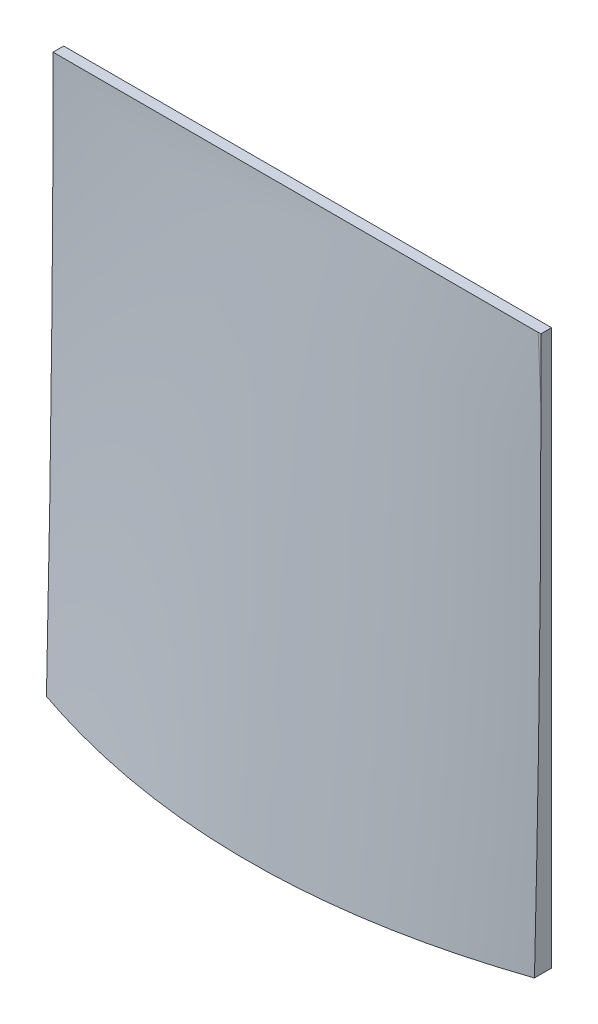
ISO-10303-21;
HEADER;
FILE_DESCRIPTION(('STEP AP214'),'2;1');
FILE_NAME('part.step','',(''),(''),'','','');
FILE_SCHEMA(('AUTOMOTIVE_DESIGN { 1 0 10303 214 1 1 1 1 }'));
ENDSEC;
DATA;
#1=APPLICATION_CONTEXT('core data for automotive mechanical design processes');
#2=APPLICATION_PROTOCOL_DEFINITION('international standard','automotive_design',2000,#1);
#3=PRODUCT_CONTEXT('',#1,'mechanical');
#4=PRODUCT('Part','Part','',(#3));
#5=PRODUCT_RELATED_PRODUCT_CATEGORY('part','',(#4));
#6=PRODUCT_DEFINITION_FORMATION('','',#4);
#7=PRODUCT_DEFINITION_CONTEXT('part definition',#1,'design');
#8=PRODUCT_DEFINITION('design','',#6,#7);
#9=PRODUCT_DEFINITION_SHAPE('','',#8);
#10=(LENGTH_UNIT() NAMED_UNIT(*) SI_UNIT(.MILLI.,.METRE.));
#11=(NAMED_UNIT(*) PLANE_ANGLE_UNIT() SI_UNIT($,.RADIAN.));
#12=(NAMED_UNIT(*) SI_UNIT($,.STERADIAN.) SOLID_ANGLE_UNIT());
#13=UNCERTAINTY_MEASURE_WITH_UNIT(LENGTH_MEASURE(1.E-05),#10,'distance_accuracy_value','');
#14=(GEOMETRIC_REPRESENTATION_CONTEXT(3) GLOBAL_UNCERTAINTY_ASSIGNED_CONTEXT((#13)) GLOBAL_UNIT_ASSIGNED_CONTEXT((#10,
#11,#12)) REPRESENTATION_CONTEXT('',''));
#15=CARTESIAN_POINT('',(0.,0.,0.));
#16=DIRECTION('',(0.,0.,1.));
#17=DIRECTION('',(1.,0.,0.));
#18=AXIS2_PLACEMENT_3D('',#15,#16,#17);
#19=CARTESIAN_POINT('',(-76.6790209222902,0.182393041457334,23.759244427129));
#20=DIRECTION('',(0.,1.,0.));
#21=DIRECTION('',(0.,0.,1.));
#22=AXIS2_PLACEMENT_3D('',#19,#20,#21);
#23=PLANE('',#22);
#24=DIRECTION('',(1.,0.,0.));
#25=VECTOR('',#24,1.);
#26=CARTESIAN_POINT('',(-76.6790209222902,0.182393041457334,45.2732626857592));
#27=LINE('',#26,#25);
#28=CARTESIAN_POINT('',(-72.7718331954869,0.182393041457337,45.2732626857592));
#29=VERTEX_POINT('',#28);
#30=CARTESIAN_POINT('',(11.2281668045131,0.182393041457337,45.2732626857592));
#31=VERTEX_POINT('',#30);
#32=EDGE_CURVE('E275',#29,#31,#27,.T.);
#33=ORIENTED_EDGE('',*,*,#32,.F.);
#34=DIRECTION('',(0.,0.,-1.));
#35=VECTOR('',#34,1.);
#36=CARTESIAN_POINT('',(-72.7718331954869,0.182393041457334,23.759244427129));
#37=LINE('',#36,#35);
#38=CARTESIAN_POINT('',(-72.7718331954869,0.182393041457334,47.1068527896374));
#39=VERTEX_POINT('',#38);
#40=EDGE_CURVE('E410',#39,#29,#37,.T.);
#41=ORIENTED_EDGE('',*,*,#40,.F.);
#42=DIRECTION('',(-0.999999985976568,0.,-0.00016747198213223));
#43=VECTOR('',#42,1.);
#44=CARTESIAN_POINT('',(-13.2520324405441,0.182393041457334,47.1168206887858));
#45=LINE('',#44,#43);
#46=CARTESIAN_POINT('',(-13.252032528791,0.182393041457334,47.1171866181923));
#47=VERTEX_POINT('',#46);
#48=EDGE_CURVE('E402',#47,#39,#45,.T.);
#49=ORIENTED_EDGE('',*,*,#48,.F.);
#50=DIRECTION('',(-0.999999910863304,0.,-0.000422224329477457));
#51=VECTOR('',#50,1.);
#52=CARTESIAN_POINT('',(10.7711074982682,0.182393041457334,47.1269638438425));
#53=LINE('',#52,#51);
#54=CARTESIAN_POINT('',(10.7711074982682,0.182393041457334,47.1269638438425));
#55=VERTEX_POINT('',#54);
#56=EDGE_CURVE('E405',#55,#47,#53,.T.);
#57=ORIENTED_EDGE('',*,*,#56,.F.);
#58=CARTESIAN_POINT('',(16.8505701588361,0.182393041457334,41.219962713963));
#59=CARTESIAN_POINT('',(16.8505653065241,0.182393041457334,41.6161075892301));
#60=CARTESIAN_POINT('',(16.8109421728378,0.182393041457334,42.0055313352953));
#61=CARTESIAN_POINT('',(16.6937660953731,0.182393041457334,42.5798712933694));
#62=CARTESIAN_POINT('',(16.6450152847532,0.182393041457334,42.7696737056762));
#63=CARTESIAN_POINT('',(16.527577589674,0.182393041457334,43.1458964318391));
#64=CARTESIAN_POINT('',(16.4587360491249,0.182393041457334,43.332289012593));
#65=CARTESIAN_POINT('',(16.2269249631052,0.182393041457334,43.8735989554252));
#66=CARTESIAN_POINT('',(16.0376753154703,0.182393041457334,44.2152440164193));
#67=CARTESIAN_POINT('',(15.7021983661332,0.182393041457334,44.6991245925857));
#68=CARTESIAN_POINT('',(15.5809595518373,0.182393041457334,44.8564583319023));
#69=CARTESIAN_POINT('',(15.3249039031078,0.182393041457334,45.1561566231294));
#70=CARTESIAN_POINT('',(15.1902206967655,0.182393041457334,45.2985817503454));
#71=CARTESIAN_POINT('',(14.766849183668,0.182393041457334,45.7043037339263));
#72=CARTESIAN_POINT('',(14.4590154618272,0.182393041457334,45.9462440529349));
#73=CARTESIAN_POINT('',(13.7911949373199,0.182393041457334,46.3719484010205));
#74=CARTESIAN_POINT('',(13.4417681116564,0.182393041457334,46.5489713969958));
#75=CARTESIAN_POINT('',(12.7142905543304,0.182393041457334,46.8352684760273));
#76=CARTESIAN_POINT('',(12.3326337261691,0.182393041457334,46.9450813361561));
#77=CARTESIAN_POINT('',(11.5584589805988,0.182393041457334,47.0906357276693));
#78=CARTESIAN_POINT('',(11.1669800896846,0.182393041457334,47.1270101951088));
#79=CARTESIAN_POINT('',(10.7711074982682,0.182393041457334,47.1269638438425));
#80=B_SPLINE_CURVE_WITH_KNOTS('',3,(#58,#59,#60,#61,#62,#63,#64,#65,#66,#67,#68,#69,#70,#71,#72,
#73,#74,#75,#76,#77,#78,#79),.UNSPECIFIED.,.F.,.F.,(4,2,2,2,2,2,2,2,2,2,4),(0.,
0.125000000000002,0.187500000000003,0.250000000000004,0.375000000000005,0.437500000000006,
0.500000000000006,0.625000000000004,0.750000000000003,0.875000000000001,1.),.UNSPECIFIED.);
#81=CARTESIAN_POINT('',(11.2281700581675,0.182393041457334,47.1106403736572));
#82=VERTEX_POINT('',#81);
#83=EDGE_CURVE('E408',#82,#55,#80,.T.);
#84=ORIENTED_EDGE('',*,*,#83,.F.);
#85=DIRECTION('',(0.,0.,1.));
#86=VECTOR('',#85,1.);
#87=CARTESIAN_POINT('',(11.2281668045131,0.182393041457334,23.759244427129));
#88=LINE('',#87,#86);
#89=EDGE_CURVE('E330',#31,#82,#88,.T.);
#90=ORIENTED_EDGE('',*,*,#89,.F.);
#91=EDGE_LOOP('',(#33,#41,#49,#57,#84,#90));
#92=FACE_BOUND('',#91,.T.);
#93=ADVANCED_FACE('F257',(#92),#23,.T.);
#94=CARTESIAN_POINT('',(11.7714281714175,0.182393041457334,22.3086914426089));
#95=CARTESIAN_POINT('',(11.7703709930804,-33.9842736252092,20.2358089414282));
#96=CARTESIAN_POINT('',(11.7693138147434,-68.1509402918758,18.1629264402475));
#97=CARTESIAN_POINT('',(11.7682566364063,-102.317606958542,16.0900439390668));
#98=CARTESIAN_POINT('',(12.5027720951188,0.182393041457334,22.3086914426089));
#99=CARTESIAN_POINT('',(12.4596525749539,-33.9842736252092,20.3915875421596));
#100=CARTESIAN_POINT('',(12.416533054789,-68.1509402918758,18.4744836417104));
#101=CARTESIAN_POINT('',(12.3734135346241,-102.317606958542,16.5573797412611));
#102=CARTESIAN_POINT('',(13.8506346332898,0.182393041457334,22.6042106392462));
#103=CARTESIAN_POINT('',(13.7769487907348,-33.9842736252092,20.9259983022181));
#104=CARTESIAN_POINT('',(13.7032629481798,-68.1509402918757,19.2477859651899));
#105=CARTESIAN_POINT('',(13.6295771056247,-102.317606958542,17.5695736281618));
#106=CARTESIAN_POINT('',(15.4638959189903,0.182393041457334,23.6789926677737));
#107=CARTESIAN_POINT('',(15.4990273118175,-33.9842736252093,22.2277872298628));
#108=CARTESIAN_POINT('',(15.5341587046448,-68.1509402918759,20.7765817919519));
#109=CARTESIAN_POINT('',(15.5692900974721,-102.317606958542,19.325376354041));
#110=CARTESIAN_POINT('',(16.559952233913,0.182393041457334,25.2561329669726));
#111=CARTESIAN_POINT('',(16.842845299821,-33.9842736252092,23.9236394232199));
#112=CARTESIAN_POINT('',(17.1257383657291,-68.1509402918757,22.5911458794671));
#113=CARTESIAN_POINT('',(17.4086314316372,-102.317606958542,21.2586523357143));
#114=CARTESIAN_POINT('',(16.8505701588361,0.182393041457334,26.5593607736293));
#115=CARTESIAN_POINT('',(17.3872298431689,-33.9842736252092,25.2359974198631));
#116=CARTESIAN_POINT('',(17.9238895275017,-68.1509402918758,23.9126340660969));
#117=CARTESIAN_POINT('',(18.4605492118345,-102.317606958542,22.5892707123306));
#118=CARTESIAN_POINT('',(16.8505701588361,0.182393041457334,28.3797658614013));
#119=CARTESIAN_POINT('',(17.7991989357432,-33.9842736252092,27.0279586717904));
#120=CARTESIAN_POINT('',(18.7478277126503,-68.1509402918758,25.6761514821794));
#121=CARTESIAN_POINT('',(19.6964564895574,-102.317606958542,24.3243442925685));
#122=CARTESIAN_POINT('',(16.8505701588361,0.182393041457333,30.678939149187));
#123=CARTESIAN_POINT('',(18.2410563181541,-33.9842736252092,29.3085689286618));
#124=CARTESIAN_POINT('',(19.6315424774721,-68.1509402918757,27.9381987081366));
#125=CARTESIAN_POINT('',(21.0220286367902,-102.317606958542,26.5678284876113));
#126=CARTESIAN_POINT('',(16.8505701588361,0.182393041457333,34.2025308556427));
#127=CARTESIAN_POINT('',(18.6331436127203,-33.9842736252092,32.8788793828374));
#128=CARTESIAN_POINT('',(20.4157170666045,-68.1509402918758,31.555227910032));
#129=CARTESIAN_POINT('',(22.1982905204886,-102.317606958542,30.2315764372267));
#130=CARTESIAN_POINT('',(16.8505701588361,0.182393041457334,37.7422086963361));
#131=CARTESIAN_POINT('',(18.6801853368826,-33.9842736252092,36.518571050225));
#132=CARTESIAN_POINT('',(20.5098005149292,-68.1509402918758,35.2949334041139));
#133=CARTESIAN_POINT('',(22.3394156929757,-102.317606958542,34.0712957580029));
#134=CARTESIAN_POINT('',(16.8505701588361,0.182393041457334,40.071716100479));
#135=CARTESIAN_POINT('',(18.4775032533534,-33.9842736252092,38.9093184064383));
#136=CARTESIAN_POINT('',(20.1044363478707,-68.1509402918758,37.7469207123975));
#137=CARTESIAN_POINT('',(21.731369442388,-102.317606958542,36.5845230183568));
#138=CARTESIAN_POINT('',(16.8505603441509,0.182393041457334,42.0212379026375));
#139=CARTESIAN_POINT('',(18.2238728448345,-33.9842736252092,40.9001374676804));
#140=CARTESIAN_POINT('',(19.597185345518,-68.1509402918758,39.7790370327232));
#141=CARTESIAN_POINT('',(20.9704978462016,-102.317606958542,38.6579365977661));
#142=CARTESIAN_POINT('',(16.5193650943029,0.182393041457333,43.6016896817839));
#143=CARTESIAN_POINT('',(17.7473024500826,-33.9842736252092,42.5119086498236));
#144=CARTESIAN_POINT('',(18.9752398058623,-68.1509402918758,41.4221276178633));
#145=CARTESIAN_POINT('',(20.203177161642,-102.317606958542,40.332346585903));
#146=CARTESIAN_POINT('',(15.1462608292416,0.182393041457334,45.5559086549865));
#147=CARTESIAN_POINT('',(16.3370504723767,-33.9842736252092,44.6051840553981));
#148=CARTESIAN_POINT('',(17.5278401155118,-68.1509402918758,43.6544594558098));
#149=CARTESIAN_POINT('',(18.7186297586469,-102.317606958542,42.7037348562215));
#150=CARTESIAN_POINT('',(13.1368960363011,0.182393041457333,46.8299753263566));
#151=CARTESIAN_POINT('',(14.4230920679013,-33.9842736252092,46.1911696211761));
#152=CARTESIAN_POINT('',(15.7092880995016,-68.1509402918758,45.5523639159955));
#153=CARTESIAN_POINT('',(16.9954841311018,-102.317606958542,44.9135582108149));
#154=CARTESIAN_POINT('',(11.5654260583025,0.182393041457334,47.1270568476824));
#155=CARTESIAN_POINT('',(12.9578931904166,-33.9842736252092,46.8431197414898));
#156=CARTESIAN_POINT('',(14.3503603225307,-68.1509402918758,46.5591826352972));
#157=CARTESIAN_POINT('',(15.7428274546449,-102.317606958542,46.2752455291046));
#158=CARTESIAN_POINT('',(10.7711074982682,0.182393041457334,47.1269638438425));
#159=CARTESIAN_POINT('',(12.2146933922623,-33.9842736252092,47.0608961147585));
#160=CARTESIAN_POINT('',(13.6582792862564,-68.1509402918758,46.9948283856745));
#161=CARTESIAN_POINT('',(15.1018651802506,-102.317606958542,46.9287606565905));
#162=B_SPLINE_SURFACE_WITH_KNOTS('',3,3,((#94,#95,#96,#97),(#98,#99,#100,#101),(#102,#103,#104,
#105),(#106,#107,#108,#109),(#110,#111,#112,#113),(#114,#115,#116,#117),(#118,#119,#120,#121),
(#122,#123,#124,#125),(#126,#127,#128,#129),(#130,#131,#132,#133),(#134,#135,#136,#137),(#138,
#139,#140,#141),(#142,#143,#144,#145),(#146,#147,#148,#149),(#150,#151,#152,#153),(#154,#155,
#156,#157),(#158,#159,#160,#161)),.UNSPECIFIED.,.F.,.F.,.F.,(4,1,1,1,2,1,1,1,2,1,1,1,4),(4,4),
(0.859588516699562,0.868888379128764,0.878188241557966,0.887488103987168,0.89678796641637,
0.911985667666167,0.927183368915964,0.94238107016576,0.957578771415557,0.968184078561668,
0.978789385707779,0.989394692853889,1.),(0.,1.),.UNSPECIFIED.);
#163=CARTESIAN_POINT('',(11.2281668053421,0.182393041457334,47.1105948279909));
#164=CARTESIAN_POINT('',(11.2281668048044,-1.42535548397624,47.1065630606311));
#165=CARTESIAN_POINT('',(11.2281668045896,-3.03310837989632,47.1039272917089));
#166=CARTESIAN_POINT('',(11.2281668044365,-6.24861268429235,47.1017158140309));
#167=CARTESIAN_POINT('',(11.2281668044981,-7.85636409276389,47.1021400986003));
#168=CARTESIAN_POINT('',(11.2281668045167,-9.85449134563653,47.1047355047199));
#169=CARTESIAN_POINT('',(11.2281668045176,-10.2448694023683,47.1053406818244));
#170=CARTESIAN_POINT('',(11.2281668045131,-10.6352472723868,47.1060458849279));
#171=B_SPLINE_CURVE_WITH_KNOTS('',3,(#163,#164,#165,#166,#167,#168,#169,#170),.UNSPECIFIED.,.F.,
.F.,(4,2,2,4),(0.,4.82326159083806,9.64651266074071,10.8176481930504),.UNSPECIFIED.);
#172=CARTESIAN_POINT('',(11.2281668045131,-10.6352472723868,47.1060458849279));
#173=VERTEX_POINT('',#172);
#174=EDGE_CURVE('E282',#82,#173,#171,.T.);
#175=CARTESIAN_POINT('',(10.7711074982682,0.182393041457334,47.1269638438425));
#176=CARTESIAN_POINT('',(12.2146933922623,-33.9842736252092,47.0608961147585));
#177=CARTESIAN_POINT('',(13.6582792862564,-68.1509402918758,46.9948283856745));
#178=CARTESIAN_POINT('',(15.1018651802506,-102.317606958542,46.9287606565905));
#179=B_SPLINE_CURVE_WITH_KNOTS('',3,(#175,#176,#177,#178),.UNSPECIFIED.,.F.,.F.,(4,4),(0.,1.),.UNSPECIFIED.);
#180=EDGE_CURVE('E355',#55,#173,#179,.T.);
#181=ORIENTED_EDGE('',*,*,#174,.F.);
#182=ORIENTED_EDGE('',*,*,#83,.T.);
#183=ORIENTED_EDGE('',*,*,#180,.T.);
#184=EDGE_LOOP('',(#181,#182,#183));
#185=FACE_BOUND('',#184,.T.);
#186=ADVANCED_FACE('F259',(#185),#162,.T.);
#187=CARTESIAN_POINT('',(10.7711074982682,0.182393041457334,47.1269638438425));
#188=CARTESIAN_POINT('',(12.2146933922623,-33.9842736252092,47.0608961147585));
#189=CARTESIAN_POINT('',(13.6582792862564,-68.1509402918758,46.9948283856745));
#190=CARTESIAN_POINT('',(15.1018651802506,-102.317606958542,46.9287606565905));
#191=CARTESIAN_POINT('',(8.77810356150516,0.182393041457334,47.1261223490166));
#192=CARTESIAN_POINT('',(10.1742030940519,-33.9842736252092,47.3421703989584));
#193=CARTESIAN_POINT('',(11.5703026265987,-68.1509402918758,47.5582184489002));
#194=CARTESIAN_POINT('',(12.9664021591454,-102.317606958542,47.774266498842));
#195=CARTESIAN_POINT('',(4.79226652396319,0.182393041457334,47.124439431496));
#196=CARTESIAN_POINT('',(6.07980800537096,-33.9842736252092,47.8710307458391));
#197=CARTESIAN_POINT('',(7.36734948677873,-68.1509402918758,48.6176220601821));
#198=CARTESIAN_POINT('',(8.6548909681865,-102.317606958542,49.3642133745251));
#199=CARTESIAN_POINT('',(-1.1962765859718,0.182393041457334,47.1219109226716));
#200=CARTESIAN_POINT('',(-0.102064190333361,-33.9842736252093,48.5543042754255));
#201=CARTESIAN_POINT('',(0.992148205305075,-68.1509402918759,49.9866976281795));
#202=CARTESIAN_POINT('',(2.08636060094351,-102.317606958542,51.4190909809335));
#203=CARTESIAN_POINT('',(-7.20507774993556,0.182393041457334,47.1193738604029));
#204=CARTESIAN_POINT('',(-6.32310650215326,-33.9842736252092,49.1197670724587));
#205=CARTESIAN_POINT('',(-5.44113525437096,-68.1509402918758,51.1201602845145));
#206=CARTESIAN_POINT('',(-4.55916400658866,-102.317606958542,53.1205534965703));
#207=CARTESIAN_POINT('',(-11.2316615618342,0.182393041457334,47.1176737386014));
#208=CARTESIAN_POINT('',(-10.4952730140214,-33.9842736252092,49.4140375223479));
#209=CARTESIAN_POINT('',(-9.7588844662086,-68.1509402918758,51.7104013060945));
#210=CARTESIAN_POINT('',(-9.0224959183958,-102.317606958542,54.0067650898411));
#211=CARTESIAN_POINT('',(-18.2217082323048,0.182393041457334,47.1159884073187));
#212=CARTESIAN_POINT('',(-17.7327170049658,-33.9842736252092,49.8499774329183));
#213=CARTESIAN_POINT('',(-17.2437257776269,-68.1509402918758,52.5839664585179));
#214=CARTESIAN_POINT('',(-16.754734550288,-102.317606958542,55.3179554841175));
#215=CARTESIAN_POINT('',(-28.1945431279432,0.182393041457333,47.1143182368678));
#216=CARTESIAN_POINT('',(-28.0775915710554,-33.9842736252093,50.2139269383705));
#217=CARTESIAN_POINT('',(-27.9606400141675,-68.150940291876,53.3135356398732));
#218=CARTESIAN_POINT('',(-27.8436884572796,-102.317606958543,56.4131443413758));
#219=CARTESIAN_POINT('',(-43.2003351938265,0.182393041457334,47.1118051870918));
#220=CARTESIAN_POINT('',(-43.6309787309255,-33.9842736252091,49.9556717395929));
#221=CARTESIAN_POINT('',(-44.0616222680245,-68.1509402918755,52.799538292094));
#222=CARTESIAN_POINT('',(-44.4922658051235,-102.317606958542,55.6434048445951));
#223=CARTESIAN_POINT('',(-58.1969563792785,0.182393041457333,47.1092936731814));
#224=CARTESIAN_POINT('',(-59.08758491262,-33.9842736252093,48.9127845569841));
#225=CARTESIAN_POINT('',(-59.9782134459615,-68.150940291876,50.7162754407867));
#226=CARTESIAN_POINT('',(-60.8688419793029,-102.317606958543,52.5197663245894));
#227=CARTESIAN_POINT('',(-68.1516724956321,0.182393041457334,47.1076265371185));
#228=CARTESIAN_POINT('',(-69.2529309821682,-33.9842736252092,47.7390805805802));
#229=CARTESIAN_POINT('',(-70.3541894687043,-68.1509402918758,48.3705346240419));
#230=CARTESIAN_POINT('',(-71.4554479552404,-102.317606958542,49.0019886675035));
#231=CARTESIAN_POINT('',(-73.109452564002,0.182393041457334,47.1067962478518));
#232=CARTESIAN_POINT('',(-74.2881455805395,-33.9842736252092,47.0474510363736));
#233=CARTESIAN_POINT('',(-75.466838597077,-68.1509402918758,46.9881058248954));
#234=CARTESIAN_POINT('',(-76.6455316136145,-102.317606958542,46.9287606134172));
#235=B_SPLINE_SURFACE_WITH_KNOTS('',3,3,((#187,#188,#189,#190),(#191,#192,#193,#194),(#195,#196,
#197,#198),(#199,#200,#201,#202),(#203,#204,#205,#206),(#207,#208,#209,#210),(#211,#212,#213,
#214),(#215,#216,#217,#218),(#219,#220,#221,#222),(#223,#224,#225,#226),(#227,#228,#229,#230),
(#231,#232,#233,#234)),.UNSPECIFIED.,.F.,.F.,.F.,(4,1,1,1,2,1,1,1,4),(4,4),(0.,0.02660957308254,
0.0532191461650799,0.0798287192476198,0.10643829233016,0.17189208729318,0.2373458822562,
0.302799677219221,0.368253472182241),(0.,1.),.UNSPECIFIED.);
#236=CARTESIAN_POINT('',(-72.7718331954869,-95.3176069585423,48.2428836262946));
#237=CARTESIAN_POINT('',(-72.7718331954869,-87.3610631236961,48.0586799988668));
#238=CARTESIAN_POINT('',(-72.7718331954869,-79.4040301643018,47.8949000780484));
#239=CARTESIAN_POINT('',(-72.7718331954869,-63.4894608929188,47.6111156960913));
#240=CARTESIAN_POINT('',(-72.7718331954869,-55.5319246077594,47.4911097252012));
#241=CARTESIAN_POINT('',(-72.7718331954869,-39.6152137727902,47.2977752925931));
#242=CARTESIAN_POINT('',(-72.7718331954869,-31.6560391460033,47.2244530557825));
#243=CARTESIAN_POINT('',(-72.7718331954869,-15.7371156390653,47.1275668632304));
#244=CARTESIAN_POINT('',(-72.7718331954869,-7.77736674857576,47.1040046241701));
#245=CARTESIAN_POINT('',(-72.7718331954869,0.182393041457334,47.1068527896374));
#246=B_SPLINE_CURVE_WITH_KNOTS('',3,(#236,#237,#238,#239,#240,#241,#242,#243,#244,#245),
.UNSPECIFIED.,.F.,.F.,(4,2,2,2,4),(0.,23.876024753362,47.75122595142,71.6296100527681,
95.508817926294),.UNSPECIFIED.);
#247=CARTESIAN_POINT('',(-72.7718331954869,-95.3176069585423,48.2428836262946));
#248=VERTEX_POINT('',#247);
#249=EDGE_CURVE('E268',#248,#39,#246,.T.);
#250=CARTESIAN_POINT('',(11.2281668045131,-95.3176069585423,48.2170139143055));
#251=CARTESIAN_POINT('',(10.2842637585676,-95.3176069585423,48.5398193567462));
#252=CARTESIAN_POINT('',(9.33706656665108,-95.3176069585423,48.8530232821917));
#253=CARTESIAN_POINT('',(7.43634800045764,-95.3176069585423,49.4596793596464));
#254=CARTESIAN_POINT('',(6.48282649626194,-95.3176069585423,49.7531311045021));
#255=CARTESIAN_POINT('',(4.56978303997249,-95.3176069585423,50.3197146009551));
#256=CARTESIAN_POINT('',(3.61026121817841,-95.3176069585423,50.592846792151));
#257=CARTESIAN_POINT('',(1.6855435092612,-95.3176069585423,51.1182017910075));
#258=CARTESIAN_POINT('',(0.720347820907171,-95.3176069585423,51.3704253265281));
#259=CARTESIAN_POINT('',(-1.21745999996783,-95.3176069585423,51.8539843187132));
#260=CARTESIAN_POINT('',(-2.19008358424145,-95.3176069585423,52.0852739146416));
#261=CARTESIAN_POINT('',(-4.14032228193785,-95.3176069585423,52.525835472865));
#262=CARTESIAN_POINT('',(-5.1179374717989,-95.3176069585423,52.735107096924));
#263=CARTESIAN_POINT('',(-7.07780191468757,-95.3176069585423,53.1311696535203));
#264=CARTESIAN_POINT('',(-8.06005154329619,-95.3176069585423,53.3179587303554));
#265=CARTESIAN_POINT('',(-10.0287864316508,-95.3176069585423,53.6686734551843));
#266=CARTESIAN_POINT('',(-11.0152723976489,-95.3176069585423,53.8325951252287));
#267=CARTESIAN_POINT('',(-13.7202290572358,-95.3176069585423,54.2492709664981));
#268=CARTESIAN_POINT('',(-15.4423931127164,-95.3176069585423,54.4784679347409));
#269=CARTESIAN_POINT('',(-18.8952384136382,-95.3176069585423,54.865101231));
#270=CARTESIAN_POINT('',(-20.6259220275209,-95.3176069585423,55.02251631464));
#271=CARTESIAN_POINT('',(-24.0926554753857,-95.3176069585423,55.2642335384948));
#272=CARTESIAN_POINT('',(-25.8287060118689,-95.3176069585423,55.3485256620931));
#273=CARTESIAN_POINT('',(-29.3029146458692,-95.3176069585423,55.4426695388545));
#274=CARTESIAN_POINT('',(-31.0410728411559,-95.3176069585423,55.4525176954207));
#275=CARTESIAN_POINT('',(-34.5156371684141,-95.3176069585423,55.3981358014778));
#276=CARTESIAN_POINT('',(-36.2520436878963,-95.3176069585423,55.3339300272214));
#277=CARTESIAN_POINT('',(-39.7205613657986,-95.3176069585423,55.1319883107887));
#278=CARTESIAN_POINT('',(-41.4526726864011,-95.3176069585423,54.9942551887479));
#279=CARTESIAN_POINT('',(-44.0450676951258,-95.3176069585423,54.7328903705772));
#280=CARTESIAN_POINT('',(-44.9081928733086,-95.3176069585423,54.636647636246));
#281=CARTESIAN_POINT('',(-46.6322336323731,-95.3176069585423,54.4260689799512));
#282=CARTESIAN_POINT('',(-47.4931491986851,-95.3176069585423,54.3117329389936));
#283=CARTESIAN_POINT('',(-50.0714908475019,-95.3176069585423,53.9420644075695));
#284=CARTESIAN_POINT('',(-51.7851867948803,-95.3176069585423,53.6600031416296));
#285=CARTESIAN_POINT('',(-54.3110622088349,-95.3176069585423,53.1915007289868));
#286=CARTESIAN_POINT('',(-55.1283027442603,-95.3176069585423,53.0316837253316));
#287=CARTESIAN_POINT('',(-56.7594260858719,-95.3176069585423,52.6963900444578));
#288=CARTESIAN_POINT('',(-57.5733094843152,-95.3176069585423,52.5209162648469));
#289=CARTESIAN_POINT('',(-59.1974985014816,-95.3176069585423,52.1545328107383));
#290=CARTESIAN_POINT('',(-60.007804486588,-95.3176069585423,51.9636247575333));
#291=CARTESIAN_POINT('',(-61.6246487812193,-95.3176069585423,51.5665955612464));
#292=CARTESIAN_POINT('',(-62.4311872303548,-95.3176069585423,51.3604749867147));
#293=CARTESIAN_POINT('',(-64.0387485262645,-95.3176069585423,50.9337526609838));
#294=CARTESIAN_POINT('',(-64.8397790338428,-95.3176069585423,50.7131797535739));
#295=CARTESIAN_POINT('',(-66.437737047914,-95.3176069585423,50.2575040317662));
#296=CARTESIAN_POINT('',(-67.2346643547319,-95.3176069585423,50.0224005173682));
#297=CARTESIAN_POINT('',(-68.8242434141734,-95.3176069585423,49.5379771734084));
#298=CARTESIAN_POINT('',(-69.6168948722129,-95.3176069585423,49.2886563777019));
#299=CARTESIAN_POINT('',(-71.197754037823,-95.3176069585423,48.7761133204435));
#300=CARTESIAN_POINT('',(-71.9859614229448,-95.3176069585423,48.5128900641779));
#301=CARTESIAN_POINT('',(-72.7718331954869,-95.3176069585423,48.2428836262946));
#302=B_SPLINE_CURVE_WITH_KNOTS('',3,(#250,#251,#252,#253,#254,#255,#256,#257,#258,#259,#260,
#261,#262,#263,#264,#265,#266,#267,#268,#269,#270,#271,#272,#273,#274,#275,#276,#277,#278,#279,
#280,#281,#282,#283,#284,#285,#286,#287,#288,#289,#290,#291,#292,#293,#294,#295,#296,#297,#298,
#299,#300,#301),.UNSPECIFIED.,.F.,.F.,(4,2,2,2,2,2,2,2,2,2,2,2,2,2,2,2,2,2,2,2,2,2,2,2,2,4),(0.,
2.992688666621,5.98543900290939,8.97812457437258,11.9707059223867,14.9696920980064,
17.9687243367532,20.9680039451505,23.9678046508806,29.1782540108573,34.390244442376,
39.6029487162976,44.815904828983,50.0271525235231,55.2382003554383,57.8434547710011,
60.4487263212387,65.6572358362802,68.1552868840602,70.6528765713651,73.1502042394732,
75.6474386200866,78.1398325250011,80.6323465926951,83.1250302431399,85.6178924860522),.UNSPECIFIED.);
#303=CARTESIAN_POINT('',(11.2281668045131,-95.3176069585423,48.2170139143055));
#304=VERTEX_POINT('',#303);
#305=EDGE_CURVE('E354',#304,#248,#302,.T.);
#306=CARTESIAN_POINT('',(11.2281668045131,-10.6352472723868,47.1060458849279));
#307=CARTESIAN_POINT('',(11.2281668045131,-17.6924795874129,47.1055572243497));
#308=CARTESIAN_POINT('',(11.2281668045131,-24.7496880232461,47.1306774909542));
#309=CARTESIAN_POINT('',(11.2281668045131,-38.8635012441874,47.2285885117725));
#310=CARTESIAN_POINT('',(11.2281668045131,-45.9201060421162,47.30137739532));
#311=CARTESIAN_POINT('',(11.2281668045131,-60.0338655531687,47.4910943343875));
#312=CARTESIAN_POINT('',(11.2281668045131,-67.0910201671043,47.6080296162592));
#313=CARTESIAN_POINT('',(11.2281668045131,-81.2048150181418,47.8827284288744));
#314=CARTESIAN_POINT('',(11.2281668045131,-88.2614552241836,48.0404935619032));
#315=CARTESIAN_POINT('',(11.2281668045131,-95.3176069585423,48.2170139143055));
#316=B_SPLINE_CURVE_WITH_KNOTS('',3,(#306,#307,#308,#309,#310,#311,#312,#313,#314,#315),
.UNSPECIFIED.,.F.,.F.,(4,2,2,2,4),(0.,21.1716137120798,42.3423966332428,63.5166465168385,
84.6917274672735),.UNSPECIFIED.);
#317=EDGE_CURVE('E323',#173,#304,#316,.T.);
#318=ORIENTED_EDGE('',*,*,#249,.F.);
#319=ORIENTED_EDGE('',*,*,#305,.F.);
#320=ORIENTED_EDGE('',*,*,#317,.F.);
#321=ORIENTED_EDGE('',*,*,#180,.F.);
#322=ORIENTED_EDGE('',*,*,#56,.T.);
#323=ORIENTED_EDGE('',*,*,#48,.T.);
#324=EDGE_LOOP('',(#318,#319,#320,#321,#322,#323));
#325=FACE_BOUND('',#324,.T.);
#326=ADVANCED_FACE('F365',(#325),#235,.T.);
#327=CARTESIAN_POINT('',(-72.7718331954869,75.6823930414577,16.0789802557285));
#328=DIRECTION('',(1.,0.,0.));
#329=DIRECTION('',(0.,0.,-1.));
#330=AXIS2_PLACEMENT_3D('',#327,#328,#329);
#331=PLANE('',#330);
#332=ORIENTED_EDGE('',*,*,#40,.T.);
#333=DIRECTION('',(0.,-1.,0.));
#334=VECTOR('',#333,1.);
#335=CARTESIAN_POINT('',(-72.7718331954869,75.6823930414577,45.2732626857592));
#336=LINE('',#335,#334);
#337=CARTESIAN_POINT('',(-72.7718331954869,-95.3176069585423,45.2732626857592));
#338=VERTEX_POINT('',#337);
#339=EDGE_CURVE('E320',#29,#338,#336,.T.);
#340=ORIENTED_EDGE('',*,*,#339,.T.);
#341=DIRECTION('',(0.,0.,-1.));
#342=VECTOR('',#341,1.);
#343=CARTESIAN_POINT('',(-72.7718331954869,-95.3176069585423,16.0789802557285));
#344=LINE('',#343,#342);
#345=EDGE_CURVE('E319',#248,#338,#344,.T.);
#346=ORIENTED_EDGE('',*,*,#345,.F.);
#347=ORIENTED_EDGE('',*,*,#249,.T.);
#348=EDGE_LOOP('',(#332,#340,#346,#347));
#349=FACE_BOUND('',#348,.T.);
#350=ADVANCED_FACE('F370',(#349),#331,.F.);
#351=CARTESIAN_POINT('',(-72.7718331954869,-95.3176069585423,16.0789802557285));
#352=DIRECTION('',(0.,1.,0.));
#353=DIRECTION('',(0.,0.,1.));
#354=AXIS2_PLACEMENT_3D('',#351,#352,#353);
#355=PLANE('',#354);
#356=ORIENTED_EDGE('',*,*,#345,.T.);
#357=DIRECTION('',(1.,0.,0.));
#358=VECTOR('',#357,1.);
#359=CARTESIAN_POINT('',(-72.7718331954869,-95.3176069585423,45.2732626857592));
#360=LINE('',#359,#358);
#361=CARTESIAN_POINT('',(11.2281668045131,-95.3176069585423,45.2732626857592));
#362=VERTEX_POINT('',#361);
#363=EDGE_CURVE('E308',#338,#362,#360,.T.);
#364=ORIENTED_EDGE('',*,*,#363,.T.);
#365=DIRECTION('',(0.,0.,-1.));
#366=VECTOR('',#365,1.);
#367=CARTESIAN_POINT('',(11.2281668045131,-95.3176069585423,16.0789802557285));
#368=LINE('',#367,#366);
#369=EDGE_CURVE('E316',#304,#362,#368,.T.);
#370=ORIENTED_EDGE('',*,*,#369,.F.);
#371=ORIENTED_EDGE('',*,*,#305,.T.);
#372=EDGE_LOOP('',(#356,#364,#370,#371));
#373=FACE_BOUND('',#372,.T.);
#374=ADVANCED_FACE('F315',(#373),#355,.F.);
#375=CARTESIAN_POINT('',(11.2281668045131,-95.3176069585423,16.0789802557285));
#376=DIRECTION('',(-1.,0.,0.));
#377=DIRECTION('',(0.,0.,1.));
#378=AXIS2_PLACEMENT_3D('',#375,#376,#377);
#379=PLANE('',#378);
#380=ORIENTED_EDGE('',*,*,#369,.T.);
#381=DIRECTION('',(0.,1.,0.));
#382=VECTOR('',#381,1.);
#383=CARTESIAN_POINT('',(11.2281668045131,-95.3176069585423,45.2732626857592));
#384=LINE('',#383,#382);
#385=EDGE_CURVE('E13',#362,#31,#384,.T.);
#386=ORIENTED_EDGE('',*,*,#385,.T.);
#387=ORIENTED_EDGE('',*,*,#89,.T.);
#388=ORIENTED_EDGE('',*,*,#174,.T.);
#389=ORIENTED_EDGE('',*,*,#317,.T.);
#390=EDGE_LOOP('',(#380,#386,#387,#388,#389));
#391=FACE_BOUND('',#390,.T.);
#392=ADVANCED_FACE('F322',(#391),#379,.F.);
#393=CARTESIAN_POINT('',(0.,0.,45.2732626857592));
#394=DIRECTION('',(0.,0.,1.));
#395=DIRECTION('',(1.,0.,0.));
#396=AXIS2_PLACEMENT_3D('',#393,#394,#395);
#397=PLANE('',#396);
#398=ORIENTED_EDGE('',*,*,#32,.T.);
#399=ORIENTED_EDGE('',*,*,#385,.F.);
#400=ORIENTED_EDGE('',*,*,#363,.F.);
#401=ORIENTED_EDGE('',*,*,#339,.F.);
#402=EDGE_LOOP('',(#398,#399,#400,#401));
#403=FACE_BOUND('',#402,.T.);
#404=ADVANCED_FACE('F307',(#403),#397,.F.);
#405=CLOSED_SHELL('',(#93,#186,#326,#350,#374,#392,#404));
#406=MANIFOLD_SOLID_BREP('B2',#405);
#407=ADVANCED_BREP_SHAPE_REPRESENTATION('',(#18,#406),#14);
#408=SHAPE_DEFINITION_REPRESENTATION(#9,#407);
ENDSEC;
END-ISO-10303-21;
